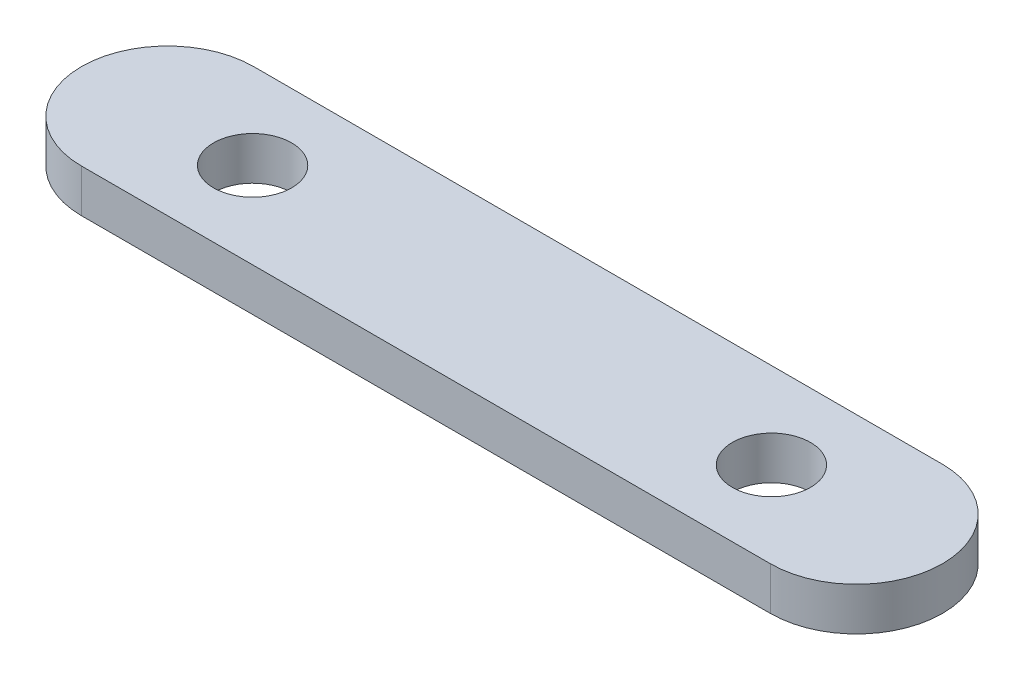
ISO-10303-21;
HEADER;
FILE_DESCRIPTION(('STEP AP214'),'2;1');
FILE_NAME('part.step','',(''),(''),'','','');
FILE_SCHEMA(('AUTOMOTIVE_DESIGN { 1 0 10303 214 1 1 1 1 }'));
ENDSEC;
DATA;
#1=APPLICATION_CONTEXT('core data for automotive mechanical design processes');
#2=APPLICATION_PROTOCOL_DEFINITION('international standard','automotive_design',2000,#1);
#3=PRODUCT_CONTEXT('',#1,'mechanical');
#4=PRODUCT('Part','Part','',(#3));
#5=PRODUCT_RELATED_PRODUCT_CATEGORY('part','',(#4));
#6=PRODUCT_DEFINITION_FORMATION('','',#4);
#7=PRODUCT_DEFINITION_CONTEXT('part definition',#1,'design');
#8=PRODUCT_DEFINITION('design','',#6,#7);
#9=PRODUCT_DEFINITION_SHAPE('','',#8);
#10=(LENGTH_UNIT() NAMED_UNIT(*) SI_UNIT(.MILLI.,.METRE.));
#11=(NAMED_UNIT(*) PLANE_ANGLE_UNIT() SI_UNIT($,.RADIAN.));
#12=(NAMED_UNIT(*) SI_UNIT($,.STERADIAN.) SOLID_ANGLE_UNIT());
#13=UNCERTAINTY_MEASURE_WITH_UNIT(LENGTH_MEASURE(1.E-05),#10,'distance_accuracy_value','');
#14=(GEOMETRIC_REPRESENTATION_CONTEXT(3) GLOBAL_UNCERTAINTY_ASSIGNED_CONTEXT((#13)) GLOBAL_UNIT_ASSIGNED_CONTEXT((#10,
#11,#12)) REPRESENTATION_CONTEXT('',''));
#15=CARTESIAN_POINT('',(0.,0.,0.));
#16=DIRECTION('',(0.,0.,1.));
#17=DIRECTION('',(1.,0.,0.));
#18=AXIS2_PLACEMENT_3D('',#15,#16,#17);
#19=CARTESIAN_POINT('',(-80.,10.,0.));
#20=DIRECTION('',(0.,-1.,0.));
#21=DIRECTION('',(0.,0.,-1.));
#22=AXIS2_PLACEMENT_3D('',#19,#20,#21);
#23=PLANE('',#22);
#24=CARTESIAN_POINT('',(-80.,10.,0.));
#25=DIRECTION('',(0.,1.,0.));
#26=DIRECTION('',(0.,0.,-1.));
#27=AXIS2_PLACEMENT_3D('',#24,#25,#26);
#28=CIRCLE('',#27,20.);
#29=CARTESIAN_POINT('',(-80.,10.,-20.));
#30=VERTEX_POINT('',#29);
#31=CARTESIAN_POINT('',(-80.,10.,20.));
#32=VERTEX_POINT('',#31);
#33=EDGE_CURVE('E88',#30,#32,#28,.T.);
#34=ORIENTED_EDGE('',*,*,#33,.T.);
#35=DIRECTION('',(1.,0.,0.));
#36=VECTOR('',#35,1.);
#37=CARTESIAN_POINT('',(80.,10.,20.));
#38=LINE('',#37,#36);
#39=CARTESIAN_POINT('',(80.,10.,20.));
#40=VERTEX_POINT('',#39);
#41=EDGE_CURVE('E83',#32,#40,#38,.T.);
#42=ORIENTED_EDGE('',*,*,#41,.T.);
#43=CARTESIAN_POINT('',(80.,10.,0.));
#44=DIRECTION('',(0.,1.,0.));
#45=DIRECTION('',(0.,0.,-1.));
#46=AXIS2_PLACEMENT_3D('',#43,#44,#45);
#47=CIRCLE('',#46,20.);
#48=CARTESIAN_POINT('',(80.,10.,-20.));
#49=VERTEX_POINT('',#48);
#50=EDGE_CURVE('E86',#40,#49,#47,.T.);
#51=ORIENTED_EDGE('',*,*,#50,.T.);
#52=DIRECTION('',(-1.,0.,0.));
#53=VECTOR('',#52,1.);
#54=CARTESIAN_POINT('',(-80.,10.,-20.));
#55=LINE('',#54,#53);
#56=EDGE_CURVE('E53',#49,#30,#55,.T.);
#57=ORIENTED_EDGE('',*,*,#56,.T.);
#58=EDGE_LOOP('',(#34,#42,#51,#57));
#59=FACE_BOUND('',#58,.T.);
#60=CARTESIAN_POINT('',(-60.25,10.,0.));
#61=DIRECTION('',(0.,1.,0.));
#62=DIRECTION('',(0.,0.,1.));
#63=AXIS2_PLACEMENT_3D('',#60,#61,#62);
#64=CIRCLE('',#63,9.06708320594104);
#65=CARTESIAN_POINT('',(-60.25,10.,9.06708320594104));
#66=VERTEX_POINT('',#65);
#67=EDGE_CURVE('E103',#66,#66,#64,.T.);
#68=ORIENTED_EDGE('',*,*,#67,.F.);
#69=EDGE_LOOP('',(#68));
#70=FACE_BOUND('',#69,.T.);
#71=CARTESIAN_POINT('',(60.25,10.,0.));
#72=DIRECTION('',(0.,1.,0.));
#73=DIRECTION('',(0.,0.,1.));
#74=AXIS2_PLACEMENT_3D('',#71,#72,#73);
#75=CIRCLE('',#74,9.06708320594104);
#76=CARTESIAN_POINT('',(60.25,10.,9.06708320594104));
#77=VERTEX_POINT('',#76);
#78=EDGE_CURVE('E118',#77,#77,#75,.T.);
#79=ORIENTED_EDGE('',*,*,#78,.F.);
#80=EDGE_LOOP('',(#79));
#81=FACE_BOUND('',#80,.T.);
#82=ADVANCED_FACE('F36',(#59,#70,#81),#23,.F.);
#83=CARTESIAN_POINT('',(-80.,0.,0.));
#84=DIRECTION('',(0.,-1.,0.));
#85=DIRECTION('',(0.,0.,-1.));
#86=AXIS2_PLACEMENT_3D('',#83,#84,#85);
#87=PLANE('',#86);
#88=CARTESIAN_POINT('',(-60.25,0.,0.));
#89=DIRECTION('',(0.,1.,0.));
#90=DIRECTION('',(0.,0.,1.));
#91=AXIS2_PLACEMENT_3D('',#88,#89,#90);
#92=CIRCLE('',#91,9.06708320594104);
#93=CARTESIAN_POINT('',(-60.25,0.,9.06708320594104));
#94=VERTEX_POINT('',#93);
#95=EDGE_CURVE('E115',#94,#94,#92,.T.);
#96=ORIENTED_EDGE('',*,*,#95,.T.);
#97=EDGE_LOOP('',(#96));
#98=FACE_BOUND('',#97,.T.);
#99=CARTESIAN_POINT('',(-80.,0.,0.));
#100=DIRECTION('',(0.,1.,0.));
#101=DIRECTION('',(0.,0.,-1.));
#102=AXIS2_PLACEMENT_3D('',#99,#100,#101);
#103=CIRCLE('',#102,20.);
#104=CARTESIAN_POINT('',(-80.,0.,-20.));
#105=VERTEX_POINT('',#104);
#106=CARTESIAN_POINT('',(-80.,0.,20.));
#107=VERTEX_POINT('',#106);
#108=EDGE_CURVE('E100',#105,#107,#103,.T.);
#109=ORIENTED_EDGE('',*,*,#108,.F.);
#110=DIRECTION('',(-1.,0.,0.));
#111=VECTOR('',#110,1.);
#112=CARTESIAN_POINT('',(-80.,0.,-20.));
#113=LINE('',#112,#111);
#114=CARTESIAN_POINT('',(80.,0.,-20.));
#115=VERTEX_POINT('',#114);
#116=EDGE_CURVE('E76',#115,#105,#113,.T.);
#117=ORIENTED_EDGE('',*,*,#116,.F.);
#118=CARTESIAN_POINT('',(80.,0.,0.));
#119=DIRECTION('',(0.,1.,0.));
#120=DIRECTION('',(0.,0.,-1.));
#121=AXIS2_PLACEMENT_3D('',#118,#119,#120);
#122=CIRCLE('',#121,20.);
#123=CARTESIAN_POINT('',(80.,0.,20.));
#124=VERTEX_POINT('',#123);
#125=EDGE_CURVE('E70',#124,#115,#122,.T.);
#126=ORIENTED_EDGE('',*,*,#125,.F.);
#127=DIRECTION('',(1.,0.,0.));
#128=VECTOR('',#127,1.);
#129=CARTESIAN_POINT('',(80.,0.,20.));
#130=LINE('',#129,#128);
#131=EDGE_CURVE('E92',#107,#124,#130,.T.);
#132=ORIENTED_EDGE('',*,*,#131,.F.);
#133=EDGE_LOOP('',(#109,#117,#126,#132));
#134=FACE_BOUND('',#133,.T.);
#135=CARTESIAN_POINT('',(60.25,0.,0.));
#136=DIRECTION('',(0.,1.,0.));
#137=DIRECTION('',(0.,0.,1.));
#138=AXIS2_PLACEMENT_3D('',#135,#136,#137);
#139=CIRCLE('',#138,9.06708320594104);
#140=CARTESIAN_POINT('',(60.25,0.,9.06708320594104));
#141=VERTEX_POINT('',#140);
#142=EDGE_CURVE('E121',#141,#141,#139,.T.);
#143=ORIENTED_EDGE('',*,*,#142,.T.);
#144=EDGE_LOOP('',(#143));
#145=FACE_BOUND('',#144,.T.);
#146=ADVANCED_FACE('F111',(#98,#134,#145),#87,.T.);
#147=CARTESIAN_POINT('',(-80.,10.,0.));
#148=DIRECTION('',(0.,-1.,0.));
#149=DIRECTION('',(0.,0.,-1.));
#150=AXIS2_PLACEMENT_3D('',#147,#148,#149);
#151=CYLINDRICAL_SURFACE('',#150,20.);
#152=ORIENTED_EDGE('',*,*,#108,.T.);
#153=DIRECTION('',(0.,-1.,0.));
#154=VECTOR('',#153,1.);
#155=CARTESIAN_POINT('',(-80.,10.,20.));
#156=LINE('',#155,#154);
#157=EDGE_CURVE('E11',#32,#107,#156,.T.);
#158=ORIENTED_EDGE('',*,*,#157,.F.);
#159=ORIENTED_EDGE('',*,*,#33,.F.);
#160=DIRECTION('',(0.,-1.,0.));
#161=VECTOR('',#160,1.);
#162=CARTESIAN_POINT('',(-80.,10.,-20.));
#163=LINE('',#162,#161);
#164=EDGE_CURVE('E96',#30,#105,#163,.T.);
#165=ORIENTED_EDGE('',*,*,#164,.T.);
#166=EDGE_LOOP('',(#152,#158,#159,#165));
#167=FACE_BOUND('',#166,.T.);
#168=ADVANCED_FACE('F38',(#167),#151,.T.);
#169=CARTESIAN_POINT('',(80.,10.,20.));
#170=DIRECTION('',(0.,0.,-1.));
#171=DIRECTION('',(-1.,0.,0.));
#172=AXIS2_PLACEMENT_3D('',#169,#170,#171);
#173=PLANE('',#172);
#174=ORIENTED_EDGE('',*,*,#131,.T.);
#175=DIRECTION('',(0.,-1.,0.));
#176=VECTOR('',#175,1.);
#177=CARTESIAN_POINT('',(80.,10.,20.));
#178=LINE('',#177,#176);
#179=EDGE_CURVE('E45',#40,#124,#178,.T.);
#180=ORIENTED_EDGE('',*,*,#179,.F.);
#181=ORIENTED_EDGE('',*,*,#41,.F.);
#182=ORIENTED_EDGE('',*,*,#157,.T.);
#183=EDGE_LOOP('',(#174,#180,#181,#182));
#184=FACE_BOUND('',#183,.T.);
#185=ADVANCED_FACE('F91',(#184),#173,.F.);
#186=CARTESIAN_POINT('',(80.,10.,0.));
#187=DIRECTION('',(0.,-1.,0.));
#188=DIRECTION('',(0.,0.,-1.));
#189=AXIS2_PLACEMENT_3D('',#186,#187,#188);
#190=CYLINDRICAL_SURFACE('',#189,20.);
#191=ORIENTED_EDGE('',*,*,#125,.T.);
#192=DIRECTION('',(0.,-1.,0.));
#193=VECTOR('',#192,1.);
#194=CARTESIAN_POINT('',(80.,10.,-20.));
#195=LINE('',#194,#193);
#196=EDGE_CURVE('E93',#49,#115,#195,.T.);
#197=ORIENTED_EDGE('',*,*,#196,.F.);
#198=ORIENTED_EDGE('',*,*,#50,.F.);
#199=ORIENTED_EDGE('',*,*,#179,.T.);
#200=EDGE_LOOP('',(#191,#197,#198,#199));
#201=FACE_BOUND('',#200,.T.);
#202=ADVANCED_FACE('F94',(#201),#190,.T.);
#203=CARTESIAN_POINT('',(-80.,10.,-20.));
#204=DIRECTION('',(0.,0.,1.));
#205=DIRECTION('',(1.,0.,0.));
#206=AXIS2_PLACEMENT_3D('',#203,#204,#205);
#207=PLANE('',#206);
#208=ORIENTED_EDGE('',*,*,#116,.T.);
#209=ORIENTED_EDGE('',*,*,#164,.F.);
#210=ORIENTED_EDGE('',*,*,#56,.F.);
#211=ORIENTED_EDGE('',*,*,#196,.T.);
#212=EDGE_LOOP('',(#208,#209,#210,#211));
#213=FACE_BOUND('',#212,.T.);
#214=ADVANCED_FACE('F108',(#213),#207,.F.);
#215=CARTESIAN_POINT('',(-60.25,10.,0.));
#216=DIRECTION('',(0.,-1.,0.));
#217=DIRECTION('',(0.,0.,-1.));
#218=AXIS2_PLACEMENT_3D('',#215,#216,#217);
#219=CYLINDRICAL_SURFACE('',#218,9.06708320594104);
#220=ORIENTED_EDGE('',*,*,#67,.T.);
#221=EDGE_LOOP('',(#220));
#222=FACE_BOUND('',#221,.T.);
#223=ORIENTED_EDGE('',*,*,#95,.F.);
#224=EDGE_LOOP('',(#223));
#225=FACE_BOUND('',#224,.T.);
#226=ADVANCED_FACE('F138',(#222,#225),#219,.F.);
#227=CARTESIAN_POINT('',(60.25,10.,0.));
#228=DIRECTION('',(0.,-1.,0.));
#229=DIRECTION('',(0.,0.,-1.));
#230=AXIS2_PLACEMENT_3D('',#227,#228,#229);
#231=CYLINDRICAL_SURFACE('',#230,9.06708320594104);
#232=ORIENTED_EDGE('',*,*,#78,.T.);
#233=EDGE_LOOP('',(#232));
#234=FACE_BOUND('',#233,.T.);
#235=ORIENTED_EDGE('',*,*,#142,.F.);
#236=EDGE_LOOP('',(#235));
#237=FACE_BOUND('',#236,.T.);
#238=ADVANCED_FACE('F127',(#234,#237),#231,.F.);
#239=CLOSED_SHELL('',(#82,#146,#168,#185,#202,#214,#226,#238));
#240=MANIFOLD_SOLID_BREP('B2',#239);
#241=ADVANCED_BREP_SHAPE_REPRESENTATION('',(#18,#240),#14);
#242=SHAPE_DEFINITION_REPRESENTATION(#9,#241);
ENDSEC;
END-ISO-10303-21;
